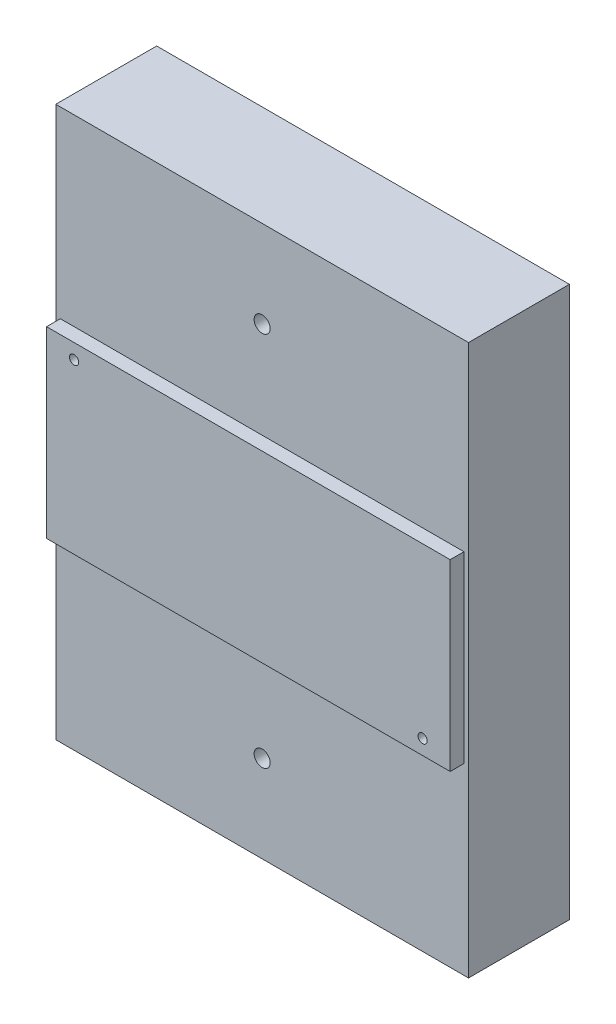
ISO-10303-21;
HEADER;
FILE_DESCRIPTION(('STEP AP214'),'2;1');
FILE_NAME('part.step','',(''),(''),'','','');
FILE_SCHEMA(('AUTOMOTIVE_DESIGN { 1 0 10303 214 1 1 1 1 }'));
ENDSEC;
DATA;
#1=APPLICATION_CONTEXT('core data for automotive mechanical design processes');
#2=APPLICATION_PROTOCOL_DEFINITION('international standard','automotive_design',2000,#1);
#3=PRODUCT_CONTEXT('',#1,'mechanical');
#4=PRODUCT('Part','Part','',(#3));
#5=PRODUCT_RELATED_PRODUCT_CATEGORY('part','',(#4));
#6=PRODUCT_DEFINITION_FORMATION('','',#4);
#7=PRODUCT_DEFINITION_CONTEXT('part definition',#1,'design');
#8=PRODUCT_DEFINITION('design','',#6,#7);
#9=PRODUCT_DEFINITION_SHAPE('','',#8);
#10=(LENGTH_UNIT() NAMED_UNIT(*) SI_UNIT(.MILLI.,.METRE.));
#11=(NAMED_UNIT(*) PLANE_ANGLE_UNIT() SI_UNIT($,.RADIAN.));
#12=(NAMED_UNIT(*) SI_UNIT($,.STERADIAN.) SOLID_ANGLE_UNIT());
#13=UNCERTAINTY_MEASURE_WITH_UNIT(LENGTH_MEASURE(1.E-05),#10,'distance_accuracy_value','');
#14=(GEOMETRIC_REPRESENTATION_CONTEXT(3) GLOBAL_UNCERTAINTY_ASSIGNED_CONTEXT((#13)) GLOBAL_UNIT_ASSIGNED_CONTEXT((#10,
#11,#12)) REPRESENTATION_CONTEXT('',''));
#15=CARTESIAN_POINT('',(0.,0.,0.));
#16=DIRECTION('',(0.,0.,1.));
#17=DIRECTION('',(1.,0.,0.));
#18=AXIS2_PLACEMENT_3D('',#15,#16,#17);
#19=CARTESIAN_POINT('',(0.,0.,22.));
#20=DIRECTION('',(0.,0.,1.));
#21=DIRECTION('',(1.,0.,0.));
#22=AXIS2_PLACEMENT_3D('',#19,#20,#21);
#23=PLANE('',#22);
#24=DIRECTION('',(0.,-1.,0.));
#25=VECTOR('',#24,1.);
#26=CARTESIAN_POINT('',(44.0000000000001,0.,22.));
#27=LINE('',#26,#25);
#28=CARTESIAN_POINT('',(44.0000000000001,20.,22.));
#29=VERTEX_POINT('',#28);
#30=CARTESIAN_POINT('',(44.0000000000001,-19.9999999999997,22.));
#31=VERTEX_POINT('',#30);
#32=EDGE_CURVE('E150',#29,#31,#27,.T.);
#33=ORIENTED_EDGE('',*,*,#32,.T.);
#34=DIRECTION('',(-1.,0.,0.));
#35=VECTOR('',#34,1.);
#36=CARTESIAN_POINT('',(0.,-19.9999999999999,22.));
#37=LINE('',#36,#35);
#38=CARTESIAN_POINT('',(-43.9999999999999,-20.,22.));
#39=VERTEX_POINT('',#38);
#40=EDGE_CURVE('E137',#31,#39,#37,.T.);
#41=ORIENTED_EDGE('',*,*,#40,.T.);
#42=DIRECTION('',(0.,1.,0.));
#43=VECTOR('',#42,1.);
#44=CARTESIAN_POINT('',(-44.,-1.45022882591661E-13,22.));
#45=LINE('',#44,#43);
#46=CARTESIAN_POINT('',(-44.0000000000001,20.,22.));
#47=VERTEX_POINT('',#46);
#48=EDGE_CURVE('E138',#39,#47,#45,.T.);
#49=ORIENTED_EDGE('',*,*,#48,.T.);
#50=DIRECTION('',(1.,0.,0.));
#51=VECTOR('',#50,1.);
#52=CARTESIAN_POINT('',(0.,20.,22.));
#53=LINE('',#52,#51);
#54=EDGE_CURVE('E141',#47,#29,#53,.T.);
#55=ORIENTED_EDGE('',*,*,#54,.T.);
#56=EDGE_LOOP('',(#33,#41,#49,#55));
#57=FACE_BOUND('',#56,.T.);
#58=CARTESIAN_POINT('',(0.,41.,22.));
#59=DIRECTION('',(0.,0.,1.));
#60=DIRECTION('',(1.,0.,0.));
#61=AXIS2_PLACEMENT_3D('',#58,#59,#60);
#62=CIRCLE('',#61,1.75);
#63=CARTESIAN_POINT('',(1.75000000000001,41.,22.));
#64=VERTEX_POINT('',#63);
#65=EDGE_CURVE('E160',#64,#64,#62,.T.);
#66=ORIENTED_EDGE('',*,*,#65,.F.);
#67=EDGE_LOOP('',(#66));
#68=FACE_BOUND('',#67,.T.);
#69=DIRECTION('',(0.,-1.,0.));
#70=VECTOR('',#69,1.);
#71=CARTESIAN_POINT('',(-45.,60.,22.));
#72=LINE('',#71,#70);
#73=CARTESIAN_POINT('',(-45.,60.,22.));
#74=VERTEX_POINT('',#73);
#75=CARTESIAN_POINT('',(-45.,-60.,22.));
#76=VERTEX_POINT('',#75);
#77=EDGE_CURVE('E166',#74,#76,#72,.T.);
#78=ORIENTED_EDGE('',*,*,#77,.T.);
#79=DIRECTION('',(1.,0.,0.));
#80=VECTOR('',#79,1.);
#81=CARTESIAN_POINT('',(-45.,-60.,22.));
#82=LINE('',#81,#80);
#83=CARTESIAN_POINT('',(45.,-60.,22.));
#84=VERTEX_POINT('',#83);
#85=EDGE_CURVE('E90',#76,#84,#82,.T.);
#86=ORIENTED_EDGE('',*,*,#85,.T.);
#87=DIRECTION('',(0.,1.,0.));
#88=VECTOR('',#87,1.);
#89=CARTESIAN_POINT('',(45.,60.,22.));
#90=LINE('',#89,#88);
#91=CARTESIAN_POINT('',(45.,60.,22.));
#92=VERTEX_POINT('',#91);
#93=EDGE_CURVE('E169',#84,#92,#90,.T.);
#94=ORIENTED_EDGE('',*,*,#93,.T.);
#95=DIRECTION('',(-1.,0.,0.));
#96=VECTOR('',#95,1.);
#97=CARTESIAN_POINT('',(-45.,60.,22.));
#98=LINE('',#97,#96);
#99=EDGE_CURVE('E61',#92,#74,#98,.T.);
#100=ORIENTED_EDGE('',*,*,#99,.T.);
#101=EDGE_LOOP('',(#78,#86,#94,#100));
#102=FACE_BOUND('',#101,.T.);
#103=CARTESIAN_POINT('',(0.,-41.,22.));
#104=DIRECTION('',(0.,0.,1.));
#105=DIRECTION('',(1.,0.,0.));
#106=AXIS2_PLACEMENT_3D('',#103,#104,#105);
#107=CIRCLE('',#106,1.75);
#108=CARTESIAN_POINT('',(1.75000000000001,-41.,22.));
#109=VERTEX_POINT('',#108);
#110=EDGE_CURVE('E154',#109,#109,#107,.T.);
#111=ORIENTED_EDGE('',*,*,#110,.F.);
#112=EDGE_LOOP('',(#111));
#113=FACE_BOUND('',#112,.T.);
#114=ADVANCED_FACE('F35',(#57,#68,#102,#113),#23,.T.);
#115=CARTESIAN_POINT('',(0.,0.,0.));
#116=DIRECTION('',(0.,0.,1.));
#117=DIRECTION('',(1.,0.,0.));
#118=AXIS2_PLACEMENT_3D('',#115,#116,#117);
#119=PLANE('',#118);
#120=DIRECTION('',(0.,-1.,0.));
#121=VECTOR('',#120,1.);
#122=CARTESIAN_POINT('',(-45.,60.,0.));
#123=LINE('',#122,#121);
#124=CARTESIAN_POINT('',(-45.,60.,0.));
#125=VERTEX_POINT('',#124);
#126=CARTESIAN_POINT('',(-45.,-60.,0.));
#127=VERTEX_POINT('',#126);
#128=EDGE_CURVE('E163',#125,#127,#123,.T.);
#129=ORIENTED_EDGE('',*,*,#128,.F.);
#130=DIRECTION('',(-1.,0.,0.));
#131=VECTOR('',#130,1.);
#132=CARTESIAN_POINT('',(-45.,60.,0.));
#133=LINE('',#132,#131);
#134=CARTESIAN_POINT('',(45.,60.,0.));
#135=VERTEX_POINT('',#134);
#136=EDGE_CURVE('E82',#135,#125,#133,.T.);
#137=ORIENTED_EDGE('',*,*,#136,.F.);
#138=DIRECTION('',(0.,1.,0.));
#139=VECTOR('',#138,1.);
#140=CARTESIAN_POINT('',(45.,60.,0.));
#141=LINE('',#140,#139);
#142=CARTESIAN_POINT('',(45.,-60.,0.));
#143=VERTEX_POINT('',#142);
#144=EDGE_CURVE('E177',#143,#135,#141,.T.);
#145=ORIENTED_EDGE('',*,*,#144,.F.);
#146=DIRECTION('',(1.,0.,0.));
#147=VECTOR('',#146,1.);
#148=CARTESIAN_POINT('',(-45.,-60.,0.));
#149=LINE('',#148,#147);
#150=EDGE_CURVE('E175',#127,#143,#149,.T.);
#151=ORIENTED_EDGE('',*,*,#150,.F.);
#152=EDGE_LOOP('',(#129,#137,#145,#151));
#153=FACE_BOUND('',#152,.T.);
#154=CARTESIAN_POINT('',(0.,41.,0.));
#155=DIRECTION('',(0.,0.,1.));
#156=DIRECTION('',(1.,0.,0.));
#157=AXIS2_PLACEMENT_3D('',#154,#155,#156);
#158=CIRCLE('',#157,1.75);
#159=CARTESIAN_POINT('',(1.75000000000001,41.,0.));
#160=VERTEX_POINT('',#159);
#161=EDGE_CURVE('E157',#160,#160,#158,.T.);
#162=ORIENTED_EDGE('',*,*,#161,.T.);
#163=EDGE_LOOP('',(#162));
#164=FACE_BOUND('',#163,.T.);
#165=CARTESIAN_POINT('',(0.,-41.,0.));
#166=DIRECTION('',(0.,0.,1.));
#167=DIRECTION('',(1.,0.,0.));
#168=AXIS2_PLACEMENT_3D('',#165,#166,#167);
#169=CIRCLE('',#168,1.75);
#170=CARTESIAN_POINT('',(1.75000000000001,-41.,0.));
#171=VERTEX_POINT('',#170);
#172=EDGE_CURVE('E153',#171,#171,#169,.T.);
#173=ORIENTED_EDGE('',*,*,#172,.T.);
#174=EDGE_LOOP('',(#173));
#175=FACE_BOUND('',#174,.T.);
#176=ADVANCED_FACE('F193',(#153,#164,#175),#119,.F.);
#177=CARTESIAN_POINT('',(-45.,60.,22.));
#178=DIRECTION('',(1.,0.,0.));
#179=DIRECTION('',(0.,0.,-1.));
#180=AXIS2_PLACEMENT_3D('',#177,#178,#179);
#181=PLANE('',#180);
#182=ORIENTED_EDGE('',*,*,#128,.T.);
#183=DIRECTION('',(0.,0.,-1.));
#184=VECTOR('',#183,1.);
#185=CARTESIAN_POINT('',(-45.,-60.,22.));
#186=LINE('',#185,#184);
#187=EDGE_CURVE('E39',#76,#127,#186,.T.);
#188=ORIENTED_EDGE('',*,*,#187,.F.);
#189=ORIENTED_EDGE('',*,*,#77,.F.);
#190=DIRECTION('',(0.,0.,-1.));
#191=VECTOR('',#190,1.);
#192=CARTESIAN_POINT('',(-45.,60.,22.));
#193=LINE('',#192,#191);
#194=EDGE_CURVE('E172',#74,#125,#193,.T.);
#195=ORIENTED_EDGE('',*,*,#194,.T.);
#196=EDGE_LOOP('',(#182,#188,#189,#195));
#197=FACE_BOUND('',#196,.T.);
#198=ADVANCED_FACE('F37',(#197),#181,.F.);
#199=CARTESIAN_POINT('',(-45.,-60.,22.));
#200=DIRECTION('',(0.,1.,0.));
#201=DIRECTION('',(-1.,0.,0.));
#202=AXIS2_PLACEMENT_3D('',#199,#200,#201);
#203=PLANE('',#202);
#204=ORIENTED_EDGE('',*,*,#150,.T.);
#205=DIRECTION('',(0.,0.,-1.));
#206=VECTOR('',#205,1.);
#207=CARTESIAN_POINT('',(45.,-60.,22.));
#208=LINE('',#207,#206);
#209=EDGE_CURVE('E182',#84,#143,#208,.T.);
#210=ORIENTED_EDGE('',*,*,#209,.F.);
#211=ORIENTED_EDGE('',*,*,#85,.F.);
#212=ORIENTED_EDGE('',*,*,#187,.T.);
#213=EDGE_LOOP('',(#204,#210,#211,#212));
#214=FACE_BOUND('',#213,.T.);
#215=ADVANCED_FACE('F188',(#214),#203,.F.);
#216=CARTESIAN_POINT('',(45.,60.,22.));
#217=DIRECTION('',(-1.,0.,0.));
#218=DIRECTION('',(0.,0.,1.));
#219=AXIS2_PLACEMENT_3D('',#216,#217,#218);
#220=PLANE('',#219);
#221=ORIENTED_EDGE('',*,*,#144,.T.);
#222=DIRECTION('',(0.,0.,-1.));
#223=VECTOR('',#222,1.);
#224=CARTESIAN_POINT('',(45.,60.,22.));
#225=LINE('',#224,#223);
#226=EDGE_CURVE('E181',#92,#135,#225,.T.);
#227=ORIENTED_EDGE('',*,*,#226,.F.);
#228=ORIENTED_EDGE('',*,*,#93,.F.);
#229=ORIENTED_EDGE('',*,*,#209,.T.);
#230=EDGE_LOOP('',(#221,#227,#228,#229));
#231=FACE_BOUND('',#230,.T.);
#232=ADVANCED_FACE('F196',(#231),#220,.F.);
#233=CARTESIAN_POINT('',(-45.,60.,22.));
#234=DIRECTION('',(0.,-1.,0.));
#235=DIRECTION('',(1.,0.,0.));
#236=AXIS2_PLACEMENT_3D('',#233,#234,#235);
#237=PLANE('',#236);
#238=ORIENTED_EDGE('',*,*,#136,.T.);
#239=ORIENTED_EDGE('',*,*,#194,.F.);
#240=ORIENTED_EDGE('',*,*,#99,.F.);
#241=ORIENTED_EDGE('',*,*,#226,.T.);
#242=EDGE_LOOP('',(#238,#239,#240,#241));
#243=FACE_BOUND('',#242,.T.);
#244=ADVANCED_FACE('F197',(#243),#237,.F.);
#245=CARTESIAN_POINT('',(0.,41.,22.));
#246=DIRECTION('',(0.,0.,-1.));
#247=DIRECTION('',(-1.,0.,0.));
#248=AXIS2_PLACEMENT_3D('',#245,#246,#247);
#249=CYLINDRICAL_SURFACE('',#248,1.75);
#250=ORIENTED_EDGE('',*,*,#65,.T.);
#251=EDGE_LOOP('',(#250));
#252=FACE_BOUND('',#251,.T.);
#253=ORIENTED_EDGE('',*,*,#161,.F.);
#254=EDGE_LOOP('',(#253));
#255=FACE_BOUND('',#254,.T.);
#256=ADVANCED_FACE('F209',(#252,#255),#249,.F.);
#257=CARTESIAN_POINT('',(0.,-41.,22.));
#258=DIRECTION('',(0.,0.,-1.));
#259=DIRECTION('',(-1.,0.,0.));
#260=AXIS2_PLACEMENT_3D('',#257,#258,#259);
#261=CYLINDRICAL_SURFACE('',#260,1.75);
#262=ORIENTED_EDGE('',*,*,#110,.T.);
#263=EDGE_LOOP('',(#262));
#264=FACE_BOUND('',#263,.T.);
#265=ORIENTED_EDGE('',*,*,#172,.F.);
#266=EDGE_LOOP('',(#265));
#267=FACE_BOUND('',#266,.T.);
#268=ADVANCED_FACE('F206',(#264,#267),#261,.F.);
#269=CARTESIAN_POINT('',(0.,0.,25.));
#270=DIRECTION('',(0.,0.,1.));
#271=DIRECTION('',(1.,0.,0.));
#272=AXIS2_PLACEMENT_3D('',#269,#270,#271);
#273=PLANE('',#272);
#274=CARTESIAN_POINT('',(-38.,16.75,25.));
#275=DIRECTION('',(0.,0.,1.));
#276=DIRECTION('',(1.,0.,0.));
#277=AXIS2_PLACEMENT_3D('',#274,#275,#276);
#278=CIRCLE('',#277,0.999999999999998);
#279=CARTESIAN_POINT('',(-37.,16.75,25.));
#280=VERTEX_POINT('',#279);
#281=EDGE_CURVE('E133',#280,#280,#278,.T.);
#282=ORIENTED_EDGE('',*,*,#281,.F.);
#283=EDGE_LOOP('',(#282));
#284=FACE_BOUND('',#283,.T.);
#285=DIRECTION('',(1.,0.,0.));
#286=VECTOR('',#285,1.);
#287=CARTESIAN_POINT('',(-43.9999999999999,-20.,25.));
#288=LINE('',#287,#286);
#289=CARTESIAN_POINT('',(-43.9999999999999,-20.,25.));
#290=VERTEX_POINT('',#289);
#291=CARTESIAN_POINT('',(44.0000000000001,-19.9999999999997,25.));
#292=VERTEX_POINT('',#291);
#293=EDGE_CURVE('E124',#290,#292,#288,.T.);
#294=ORIENTED_EDGE('',*,*,#293,.T.);
#295=DIRECTION('',(0.,1.,0.));
#296=VECTOR('',#295,1.);
#297=CARTESIAN_POINT('',(44.0000000000001,-19.9999999999997,25.));
#298=LINE('',#297,#296);
#299=CARTESIAN_POINT('',(44.0000000000001,20.,25.));
#300=VERTEX_POINT('',#299);
#301=EDGE_CURVE('E113',#292,#300,#298,.T.);
#302=ORIENTED_EDGE('',*,*,#301,.T.);
#303=DIRECTION('',(-1.,0.,0.));
#304=VECTOR('',#303,1.);
#305=CARTESIAN_POINT('',(-44.,20.,25.));
#306=LINE('',#305,#304);
#307=CARTESIAN_POINT('',(-44.,20.,25.));
#308=VERTEX_POINT('',#307);
#309=EDGE_CURVE('E123',#300,#308,#306,.T.);
#310=ORIENTED_EDGE('',*,*,#309,.T.);
#311=DIRECTION('',(0.,-1.,0.));
#312=VECTOR('',#311,1.);
#313=CARTESIAN_POINT('',(-43.9999999999999,-20.,25.));
#314=LINE('',#313,#312);
#315=EDGE_CURVE('E129',#308,#290,#314,.T.);
#316=ORIENTED_EDGE('',*,*,#315,.T.);
#317=EDGE_LOOP('',(#294,#302,#310,#316));
#318=FACE_BOUND('',#317,.T.);
#319=CARTESIAN_POINT('',(38.,-16.75,25.));
#320=DIRECTION('',(0.,0.,1.));
#321=DIRECTION('',(1.,0.,0.));
#322=AXIS2_PLACEMENT_3D('',#319,#320,#321);
#323=CIRCLE('',#322,0.999999999999998);
#324=CARTESIAN_POINT('',(39.,-16.75,25.));
#325=VERTEX_POINT('',#324);
#326=EDGE_CURVE('E356',#325,#325,#323,.T.);
#327=ORIENTED_EDGE('',*,*,#326,.F.);
#328=EDGE_LOOP('',(#327));
#329=FACE_BOUND('',#328,.T.);
#330=ADVANCED_FACE('F127',(#284,#318,#329),#273,.T.);
#331=CARTESIAN_POINT('',(-43.9999999999999,-20.,25.));
#332=DIRECTION('',(0.,1.,0.));
#333=DIRECTION('',(-1.,0.,0.));
#334=AXIS2_PLACEMENT_3D('',#331,#332,#333);
#335=PLANE('',#334);
#336=ORIENTED_EDGE('',*,*,#40,.F.);
#337=DIRECTION('',(0.,0.,-1.));
#338=VECTOR('',#337,1.);
#339=CARTESIAN_POINT('',(44.0000000000001,-19.9999999999997,25.));
#340=LINE('',#339,#338);
#341=EDGE_CURVE('E117',#292,#31,#340,.T.);
#342=ORIENTED_EDGE('',*,*,#341,.F.);
#343=ORIENTED_EDGE('',*,*,#293,.F.);
#344=DIRECTION('',(0.,0.,-1.));
#345=VECTOR('',#344,1.);
#346=CARTESIAN_POINT('',(-43.9999999999999,-20.,25.));
#347=LINE('',#346,#345);
#348=EDGE_CURVE('E363',#290,#39,#347,.T.);
#349=ORIENTED_EDGE('',*,*,#348,.T.);
#350=EDGE_LOOP('',(#336,#342,#343,#349));
#351=FACE_BOUND('',#350,.T.);
#352=ADVANCED_FACE('F135',(#351),#335,.F.);
#353=CARTESIAN_POINT('',(44.0000000000001,-19.9999999999997,25.));
#354=DIRECTION('',(-1.,0.,0.));
#355=DIRECTION('',(0.,-1.,0.));
#356=AXIS2_PLACEMENT_3D('',#353,#354,#355);
#357=PLANE('',#356);
#358=ORIENTED_EDGE('',*,*,#32,.F.);
#359=DIRECTION('',(0.,0.,-1.));
#360=VECTOR('',#359,1.);
#361=CARTESIAN_POINT('',(44.0000000000001,20.,25.));
#362=LINE('',#361,#360);
#363=EDGE_CURVE('E120',#300,#29,#362,.T.);
#364=ORIENTED_EDGE('',*,*,#363,.F.);
#365=ORIENTED_EDGE('',*,*,#301,.F.);
#366=ORIENTED_EDGE('',*,*,#341,.T.);
#367=EDGE_LOOP('',(#358,#364,#365,#366));
#368=FACE_BOUND('',#367,.T.);
#369=ADVANCED_FACE('F115',(#368),#357,.F.);
#370=CARTESIAN_POINT('',(-44.,20.,25.));
#371=DIRECTION('',(0.,-1.,0.));
#372=DIRECTION('',(1.,0.,0.));
#373=AXIS2_PLACEMENT_3D('',#370,#371,#372);
#374=PLANE('',#373);
#375=ORIENTED_EDGE('',*,*,#54,.F.);
#376=DIRECTION('',(0.,0.,-1.));
#377=VECTOR('',#376,1.);
#378=CARTESIAN_POINT('',(-44.,20.,25.));
#379=LINE('',#378,#377);
#380=EDGE_CURVE('E52',#308,#47,#379,.T.);
#381=ORIENTED_EDGE('',*,*,#380,.F.);
#382=ORIENTED_EDGE('',*,*,#309,.F.);
#383=ORIENTED_EDGE('',*,*,#363,.T.);
#384=EDGE_LOOP('',(#375,#381,#382,#383));
#385=FACE_BOUND('',#384,.T.);
#386=ADVANCED_FACE('F266',(#385),#374,.F.);
#387=CARTESIAN_POINT('',(-43.9999999999999,-20.,25.));
#388=DIRECTION('',(1.,0.,0.));
#389=DIRECTION('',(0.,1.,0.));
#390=AXIS2_PLACEMENT_3D('',#387,#388,#389);
#391=PLANE('',#390);
#392=ORIENTED_EDGE('',*,*,#48,.F.);
#393=ORIENTED_EDGE('',*,*,#348,.F.);
#394=ORIENTED_EDGE('',*,*,#315,.F.);
#395=ORIENTED_EDGE('',*,*,#380,.T.);
#396=EDGE_LOOP('',(#392,#393,#394,#395));
#397=FACE_BOUND('',#396,.T.);
#398=ADVANCED_FACE('F273',(#397),#391,.F.);
#399=CARTESIAN_POINT('',(-38.,16.75,25.));
#400=DIRECTION('',(0.,0.,-1.));
#401=DIRECTION('',(-1.,0.,0.));
#402=AXIS2_PLACEMENT_3D('',#399,#400,#401);
#403=CYLINDRICAL_SURFACE('',#402,0.999999999999998);
#404=CARTESIAN_POINT('',(-38.,16.75,22.));
#405=DIRECTION('',(0.,0.,1.));
#406=DIRECTION('',(1.,0.,0.));
#407=AXIS2_PLACEMENT_3D('',#404,#405,#406);
#408=CIRCLE('',#407,0.999999999999998);
#409=CARTESIAN_POINT('',(-37.,16.75,22.));
#410=VERTEX_POINT('',#409);
#411=EDGE_CURVE('E11',#410,#410,#408,.F.);
#412=ORIENTED_EDGE('',*,*,#411,.T.);
#413=EDGE_LOOP('',(#412));
#414=FACE_BOUND('',#413,.T.);
#415=ORIENTED_EDGE('',*,*,#281,.T.);
#416=EDGE_LOOP('',(#415));
#417=FACE_BOUND('',#416,.T.);
#418=ADVANCED_FACE('F281',(#414,#417),#403,.F.);
#419=CARTESIAN_POINT('',(38.,-16.75,25.));
#420=DIRECTION('',(0.,0.,-1.));
#421=DIRECTION('',(-1.,0.,0.));
#422=AXIS2_PLACEMENT_3D('',#419,#420,#421);
#423=CYLINDRICAL_SURFACE('',#422,0.999999999999998);
#424=CARTESIAN_POINT('',(38.,-16.75,22.));
#425=DIRECTION('',(0.,0.,1.));
#426=DIRECTION('',(1.,0.,0.));
#427=AXIS2_PLACEMENT_3D('',#424,#425,#426);
#428=CIRCLE('',#427,0.999999999999998);
#429=CARTESIAN_POINT('',(39.,-16.75,22.));
#430=VERTEX_POINT('',#429);
#431=EDGE_CURVE('E44',#430,#430,#428,.F.);
#432=ORIENTED_EDGE('',*,*,#431,.T.);
#433=EDGE_LOOP('',(#432));
#434=FACE_BOUND('',#433,.T.);
#435=ORIENTED_EDGE('',*,*,#326,.T.);
#436=EDGE_LOOP('',(#435));
#437=FACE_BOUND('',#436,.T.);
#438=ADVANCED_FACE('F288',(#434,#437),#423,.F.);
#439=ORIENTED_EDGE('',*,*,#431,.F.);
#440=EDGE_LOOP('',(#439));
#441=FACE_BOUND('',#440,.T.);
#442=ADVANCED_FACE('F203',(#441),#23,.T.);
#443=ORIENTED_EDGE('',*,*,#411,.F.);
#444=EDGE_LOOP('',(#443));
#445=FACE_BOUND('',#444,.T.);
#446=ADVANCED_FACE('F202',(#445),#23,.T.);
#447=CLOSED_SHELL('',(#114,#176,#198,#215,#232,#244,#256,#268,#330,#352,#369,#386,#398,#418,
#438,#442,#446));
#448=MANIFOLD_SOLID_BREP('B2',#447);
#449=ADVANCED_BREP_SHAPE_REPRESENTATION('',(#18,#448),#14);
#450=SHAPE_DEFINITION_REPRESENTATION(#9,#449);
ENDSEC;
END-ISO-10303-21;
